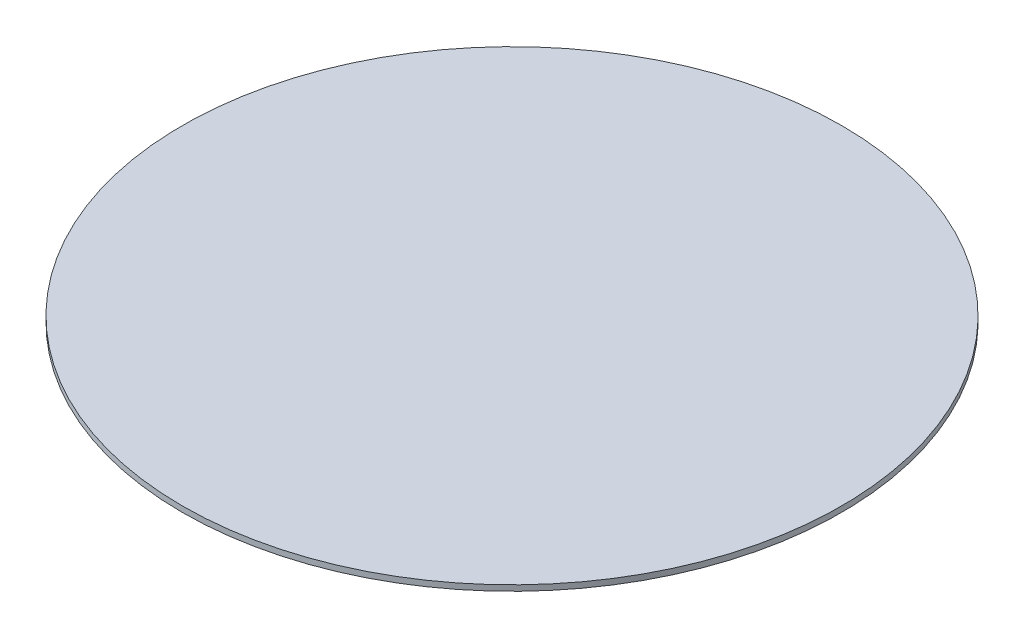
ISO-10303-21;
HEADER;
FILE_DESCRIPTION(('STEP AP214'),'2;1');
FILE_NAME('part.step','',(''),(''),'','','');
FILE_SCHEMA(('AUTOMOTIVE_DESIGN { 1 0 10303 214 1 1 1 1 }'));
ENDSEC;
DATA;
#1=APPLICATION_CONTEXT('core data for automotive mechanical design processes');
#2=APPLICATION_PROTOCOL_DEFINITION('international standard','automotive_design',2000,#1);
#3=PRODUCT_CONTEXT('',#1,'mechanical');
#4=PRODUCT('Part','Part','',(#3));
#5=PRODUCT_RELATED_PRODUCT_CATEGORY('part','',(#4));
#6=PRODUCT_DEFINITION_FORMATION('','',#4);
#7=PRODUCT_DEFINITION_CONTEXT('part definition',#1,'design');
#8=PRODUCT_DEFINITION('design','',#6,#7);
#9=PRODUCT_DEFINITION_SHAPE('','',#8);
#10=(LENGTH_UNIT() NAMED_UNIT(*) SI_UNIT(.MILLI.,.METRE.));
#11=(NAMED_UNIT(*) PLANE_ANGLE_UNIT() SI_UNIT($,.RADIAN.));
#12=(NAMED_UNIT(*) SI_UNIT($,.STERADIAN.) SOLID_ANGLE_UNIT());
#13=UNCERTAINTY_MEASURE_WITH_UNIT(LENGTH_MEASURE(1.E-05),#10,'distance_accuracy_value','');
#14=(GEOMETRIC_REPRESENTATION_CONTEXT(3) GLOBAL_UNCERTAINTY_ASSIGNED_CONTEXT((#13)) GLOBAL_UNIT_ASSIGNED_CONTEXT((#10,
#11,#12)) REPRESENTATION_CONTEXT('',''));
#15=CARTESIAN_POINT('',(0.,0.,0.));
#16=DIRECTION('',(0.,0.,1.));
#17=DIRECTION('',(1.,0.,0.));
#18=AXIS2_PLACEMENT_3D('',#15,#16,#17);
#19=CARTESIAN_POINT('',(0.,3.,0.));
#20=DIRECTION('',(0.,-1.,0.));
#21=DIRECTION('',(0.,0.,-1.));
#22=AXIS2_PLACEMENT_3D('',#19,#20,#21);
#23=CYLINDRICAL_SURFACE('',#22,175.);
#24=CARTESIAN_POINT('',(0.,3.,0.));
#25=DIRECTION('',(0.,1.,0.));
#26=DIRECTION('',(0.,0.,1.));
#27=AXIS2_PLACEMENT_3D('',#24,#25,#26);
#28=CIRCLE('',#27,175.);
#29=CARTESIAN_POINT('',(0.,3.,175.));
#30=VERTEX_POINT('',#29);
#31=EDGE_CURVE('E10',#30,#30,#28,.T.);
#32=ORIENTED_EDGE('',*,*,#31,.F.);
#33=EDGE_LOOP('',(#32));
#34=FACE_BOUND('',#33,.T.);
#35=CARTESIAN_POINT('',(0.,0.,0.));
#36=DIRECTION('',(0.,1.,0.));
#37=DIRECTION('',(0.,0.,1.));
#38=AXIS2_PLACEMENT_3D('',#35,#36,#37);
#39=CIRCLE('',#38,175.);
#40=CARTESIAN_POINT('',(0.,0.,175.));
#41=VERTEX_POINT('',#40);
#42=EDGE_CURVE('E46',#41,#41,#39,.T.);
#43=ORIENTED_EDGE('',*,*,#42,.T.);
#44=EDGE_LOOP('',(#43));
#45=FACE_BOUND('',#44,.T.);
#46=ADVANCED_FACE('F43',(#34,#45),#23,.T.);
#47=CARTESIAN_POINT('',(0.,3.,0.));
#48=DIRECTION('',(0.,1.,0.));
#49=DIRECTION('',(0.,0.,1.));
#50=AXIS2_PLACEMENT_3D('',#47,#48,#49);
#51=PLANE('',#50);
#52=ORIENTED_EDGE('',*,*,#31,.T.);
#53=EDGE_LOOP('',(#52));
#54=FACE_BOUND('',#53,.T.);
#55=ADVANCED_FACE('F60',(#54),#51,.T.);
#56=CARTESIAN_POINT('',(0.,0.,0.));
#57=DIRECTION('',(0.,1.,0.));
#58=DIRECTION('',(0.,0.,1.));
#59=AXIS2_PLACEMENT_3D('',#56,#57,#58);
#60=PLANE('',#59);
#61=ORIENTED_EDGE('',*,*,#42,.F.);
#62=EDGE_LOOP('',(#61));
#63=FACE_BOUND('',#62,.T.);
#64=ADVANCED_FACE('F58',(#63),#60,.F.);
#65=CLOSED_SHELL('',(#46,#55,#64));
#66=MANIFOLD_SOLID_BREP('B2',#65);
#67=ADVANCED_BREP_SHAPE_REPRESENTATION('',(#18,#66),#14);
#68=SHAPE_DEFINITION_REPRESENTATION(#9,#67);
ENDSEC;
END-ISO-10303-21;
